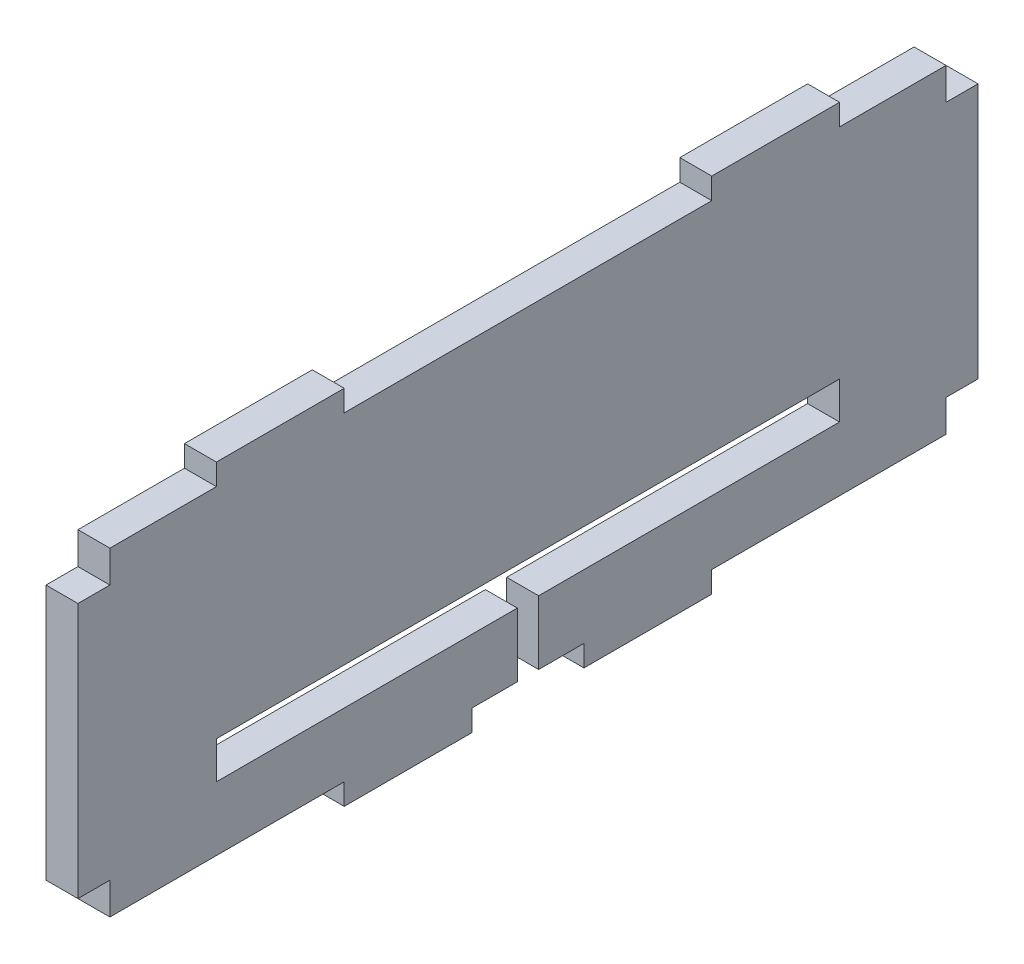
ISO-10303-21;
HEADER;
FILE_DESCRIPTION(('STEP AP214'),'2;1');
FILE_NAME('part.step','',(''),(''),'','','');
FILE_SCHEMA(('AUTOMOTIVE_DESIGN { 1 0 10303 214 1 1 1 1 }'));
ENDSEC;
DATA;
#1=APPLICATION_CONTEXT('core data for automotive mechanical design processes');
#2=APPLICATION_PROTOCOL_DEFINITION('international standard','automotive_design',2000,#1);
#3=PRODUCT_CONTEXT('',#1,'mechanical');
#4=PRODUCT('Part','Part','',(#3));
#5=PRODUCT_RELATED_PRODUCT_CATEGORY('part','',(#4));
#6=PRODUCT_DEFINITION_FORMATION('','',#4);
#7=PRODUCT_DEFINITION_CONTEXT('part definition',#1,'design');
#8=PRODUCT_DEFINITION('design','',#6,#7);
#9=PRODUCT_DEFINITION_SHAPE('','',#8);
#10=(LENGTH_UNIT() NAMED_UNIT(*) SI_UNIT(.MILLI.,.METRE.));
#11=(NAMED_UNIT(*) PLANE_ANGLE_UNIT() SI_UNIT($,.RADIAN.));
#12=(NAMED_UNIT(*) SI_UNIT($,.STERADIAN.) SOLID_ANGLE_UNIT());
#13=UNCERTAINTY_MEASURE_WITH_UNIT(LENGTH_MEASURE(1.E-05),#10,'distance_accuracy_value','');
#14=(GEOMETRIC_REPRESENTATION_CONTEXT(3) GLOBAL_UNCERTAINTY_ASSIGNED_CONTEXT((#13)) GLOBAL_UNIT_ASSIGNED_CONTEXT((#10,
#11,#12)) REPRESENTATION_CONTEXT('',''));
#15=CARTESIAN_POINT('',(0.,0.,0.));
#16=DIRECTION('',(0.,0.,1.));
#17=DIRECTION('',(1.,0.,0.));
#18=AXIS2_PLACEMENT_3D('',#15,#16,#17);
#19=CARTESIAN_POINT('',(3.,29.,0.));
#20=DIRECTION('',(0.,1.,0.));
#21=DIRECTION('',(0.,0.,1.));
#22=AXIS2_PLACEMENT_3D('',#19,#20,#21);
#23=PLANE('',#22);
#24=DIRECTION('',(0.,0.,-1.));
#25=VECTOR('',#24,1.);
#26=CARTESIAN_POINT('',(0.,29.,0.));
#27=LINE('',#26,#25);
#28=CARTESIAN_POINT('',(0.,29.,-81.51));
#29=VERTEX_POINT('',#28);
#30=CARTESIAN_POINT('',(0.,29.,-84.51));
#31=VERTEX_POINT('',#30);
#32=EDGE_CURVE('E295',#29,#31,#27,.T.);
#33=ORIENTED_EDGE('',*,*,#32,.F.);
#34=DIRECTION('',(-1.,0.,0.));
#35=VECTOR('',#34,1.);
#36=CARTESIAN_POINT('',(3.,29.,-81.51));
#37=LINE('',#36,#35);
#38=CARTESIAN_POINT('',(3.,29.,-81.51));
#39=VERTEX_POINT('',#38);
#40=EDGE_CURVE('E11',#39,#29,#37,.T.);
#41=ORIENTED_EDGE('',*,*,#40,.F.);
#42=DIRECTION('',(0.,0.,-1.));
#43=VECTOR('',#42,1.);
#44=CARTESIAN_POINT('',(3.,29.,0.));
#45=LINE('',#44,#43);
#46=CARTESIAN_POINT('',(3.,29.,-84.51));
#47=VERTEX_POINT('',#46);
#48=EDGE_CURVE('E379',#39,#47,#45,.T.);
#49=ORIENTED_EDGE('',*,*,#48,.T.);
#50=DIRECTION('',(-1.,0.,0.));
#51=VECTOR('',#50,1.);
#52=CARTESIAN_POINT('',(3.,29.,-84.51));
#53=LINE('',#52,#51);
#54=EDGE_CURVE('E170',#47,#31,#53,.T.);
#55=ORIENTED_EDGE('',*,*,#54,.T.);
#56=EDGE_LOOP('',(#33,#41,#49,#55));
#57=FACE_BOUND('',#56,.T.);
#58=ADVANCED_FACE('F35',(#57),#23,.T.);
#59=CARTESIAN_POINT('',(3.,0.,-81.51));
#60=DIRECTION('',(0.,0.,-1.));
#61=DIRECTION('',(-1.,0.,0.));
#62=AXIS2_PLACEMENT_3D('',#59,#60,#61);
#63=PLANE('',#62);
#64=DIRECTION('',(0.,-1.,0.));
#65=VECTOR('',#64,1.);
#66=CARTESIAN_POINT('',(0.,0.,-81.51));
#67=LINE('',#66,#65);
#68=CARTESIAN_POINT('',(0.,32.,-81.51));
#69=VERTEX_POINT('',#68);
#70=EDGE_CURVE('E298',#69,#29,#67,.T.);
#71=ORIENTED_EDGE('',*,*,#70,.F.);
#72=DIRECTION('',(-1.,0.,0.));
#73=VECTOR('',#72,1.);
#74=CARTESIAN_POINT('',(3.,32.,-81.51));
#75=LINE('',#74,#73);
#76=CARTESIAN_POINT('',(3.,32.,-81.51));
#77=VERTEX_POINT('',#76);
#78=EDGE_CURVE('E43',#77,#69,#75,.T.);
#79=ORIENTED_EDGE('',*,*,#78,.F.);
#80=DIRECTION('',(0.,-1.,0.));
#81=VECTOR('',#80,1.);
#82=CARTESIAN_POINT('',(3.,0.,-81.51));
#83=LINE('',#82,#81);
#84=EDGE_CURVE('E479',#77,#39,#83,.T.);
#85=ORIENTED_EDGE('',*,*,#84,.T.);
#86=ORIENTED_EDGE('',*,*,#40,.T.);
#87=EDGE_LOOP('',(#71,#79,#85,#86));
#88=FACE_BOUND('',#87,.T.);
#89=ADVANCED_FACE('F467',(#88),#63,.T.);
#90=CARTESIAN_POINT('',(3.,32.,0.));
#91=DIRECTION('',(0.,1.,0.));
#92=DIRECTION('',(0.,0.,1.));
#93=AXIS2_PLACEMENT_3D('',#90,#91,#92);
#94=PLANE('',#93);
#95=DIRECTION('',(0.,0.,-1.));
#96=VECTOR('',#95,1.);
#97=CARTESIAN_POINT('',(0.,32.,0.));
#98=LINE('',#97,#96);
#99=CARTESIAN_POINT('',(0.,32.,-71.51));
#100=VERTEX_POINT('',#99);
#101=EDGE_CURVE('E301',#100,#69,#98,.T.);
#102=ORIENTED_EDGE('',*,*,#101,.F.);
#103=DIRECTION('',(-1.,0.,0.));
#104=VECTOR('',#103,1.);
#105=CARTESIAN_POINT('',(3.,32.,-71.51));
#106=LINE('',#105,#104);
#107=CARTESIAN_POINT('',(3.,32.,-71.51));
#108=VERTEX_POINT('',#107);
#109=EDGE_CURVE('E456',#108,#100,#106,.T.);
#110=ORIENTED_EDGE('',*,*,#109,.F.);
#111=DIRECTION('',(0.,0.,-1.));
#112=VECTOR('',#111,1.);
#113=CARTESIAN_POINT('',(3.,32.,0.));
#114=LINE('',#113,#112);
#115=EDGE_CURVE('E463',#108,#77,#114,.T.);
#116=ORIENTED_EDGE('',*,*,#115,.T.);
#117=ORIENTED_EDGE('',*,*,#78,.T.);
#118=EDGE_LOOP('',(#102,#110,#116,#117));
#119=FACE_BOUND('',#118,.T.);
#120=ADVANCED_FACE('F461',(#119),#94,.T.);
#121=CARTESIAN_POINT('',(3.,0.,-71.51));
#122=DIRECTION('',(0.,0.,-1.));
#123=DIRECTION('',(-1.,0.,0.));
#124=AXIS2_PLACEMENT_3D('',#121,#122,#123);
#125=PLANE('',#124);
#126=DIRECTION('',(0.,-1.,0.));
#127=VECTOR('',#126,1.);
#128=CARTESIAN_POINT('',(0.,0.,-71.51));
#129=LINE('',#128,#127);
#130=CARTESIAN_POINT('',(0.,34.,-71.51));
#131=VERTEX_POINT('',#130);
#132=EDGE_CURVE('E304',#131,#100,#129,.T.);
#133=ORIENTED_EDGE('',*,*,#132,.F.);
#134=DIRECTION('',(-1.,0.,0.));
#135=VECTOR('',#134,1.);
#136=CARTESIAN_POINT('',(3.,34.,-71.51));
#137=LINE('',#136,#135);
#138=CARTESIAN_POINT('',(3.,34.,-71.51));
#139=VERTEX_POINT('',#138);
#140=EDGE_CURVE('E454',#139,#131,#137,.T.);
#141=ORIENTED_EDGE('',*,*,#140,.F.);
#142=DIRECTION('',(0.,-1.,0.));
#143=VECTOR('',#142,1.);
#144=CARTESIAN_POINT('',(3.,0.,-71.51));
#145=LINE('',#144,#143);
#146=EDGE_CURVE('E476',#139,#108,#145,.T.);
#147=ORIENTED_EDGE('',*,*,#146,.T.);
#148=ORIENTED_EDGE('',*,*,#109,.T.);
#149=EDGE_LOOP('',(#133,#141,#147,#148));
#150=FACE_BOUND('',#149,.T.);
#151=ADVANCED_FACE('F473',(#150),#125,.T.);
#152=CARTESIAN_POINT('',(3.,34.,0.));
#153=DIRECTION('',(0.,1.,0.));
#154=DIRECTION('',(0.,0.,1.));
#155=AXIS2_PLACEMENT_3D('',#152,#153,#154);
#156=PLANE('',#155);
#157=DIRECTION('',(0.,0.,-1.));
#158=VECTOR('',#157,1.);
#159=CARTESIAN_POINT('',(0.,34.,0.));
#160=LINE('',#159,#158);
#161=CARTESIAN_POINT('',(0.,34.,-59.51));
#162=VERTEX_POINT('',#161);
#163=EDGE_CURVE('E307',#162,#131,#160,.T.);
#164=ORIENTED_EDGE('',*,*,#163,.F.);
#165=DIRECTION('',(-1.,0.,0.));
#166=VECTOR('',#165,1.);
#167=CARTESIAN_POINT('',(3.,34.,-59.51));
#168=LINE('',#167,#166);
#169=CARTESIAN_POINT('',(3.,34.,-59.51));
#170=VERTEX_POINT('',#169);
#171=EDGE_CURVE('E452',#170,#162,#168,.T.);
#172=ORIENTED_EDGE('',*,*,#171,.F.);
#173=DIRECTION('',(0.,0.,-1.));
#174=VECTOR('',#173,1.);
#175=CARTESIAN_POINT('',(3.,34.,0.));
#176=LINE('',#175,#174);
#177=EDGE_CURVE('E481',#170,#139,#176,.T.);
#178=ORIENTED_EDGE('',*,*,#177,.T.);
#179=ORIENTED_EDGE('',*,*,#140,.T.);
#180=EDGE_LOOP('',(#164,#172,#178,#179));
#181=FACE_BOUND('',#180,.T.);
#182=ADVANCED_FACE('F577',(#181),#156,.T.);
#183=CARTESIAN_POINT('',(3.,0.,-59.51));
#184=DIRECTION('',(0.,0.,1.));
#185=DIRECTION('',(1.,0.,0.));
#186=AXIS2_PLACEMENT_3D('',#183,#184,#185);
#187=PLANE('',#186);
#188=DIRECTION('',(0.,1.,0.));
#189=VECTOR('',#188,1.);
#190=CARTESIAN_POINT('',(0.,0.,-59.51));
#191=LINE('',#190,#189);
#192=CARTESIAN_POINT('',(0.,32.,-59.51));
#193=VERTEX_POINT('',#192);
#194=EDGE_CURVE('E310',#193,#162,#191,.T.);
#195=ORIENTED_EDGE('',*,*,#194,.F.);
#196=DIRECTION('',(-1.,0.,0.));
#197=VECTOR('',#196,1.);
#198=CARTESIAN_POINT('',(3.,32.,-59.51));
#199=LINE('',#198,#197);
#200=CARTESIAN_POINT('',(3.,32.,-59.51));
#201=VERTEX_POINT('',#200);
#202=EDGE_CURVE('E450',#201,#193,#199,.T.);
#203=ORIENTED_EDGE('',*,*,#202,.F.);
#204=DIRECTION('',(0.,1.,0.));
#205=VECTOR('',#204,1.);
#206=CARTESIAN_POINT('',(3.,0.,-59.51));
#207=LINE('',#206,#205);
#208=EDGE_CURVE('E487',#201,#170,#207,.T.);
#209=ORIENTED_EDGE('',*,*,#208,.T.);
#210=ORIENTED_EDGE('',*,*,#171,.T.);
#211=EDGE_LOOP('',(#195,#203,#209,#210));
#212=FACE_BOUND('',#211,.T.);
#213=ADVANCED_FACE('F578',(#212),#187,.T.);
#214=CARTESIAN_POINT('',(3.,32.,0.));
#215=DIRECTION('',(0.,1.,0.));
#216=DIRECTION('',(0.,0.,1.));
#217=AXIS2_PLACEMENT_3D('',#214,#215,#216);
#218=PLANE('',#217);
#219=DIRECTION('',(0.,0.,-1.));
#220=VECTOR('',#219,1.);
#221=CARTESIAN_POINT('',(0.,32.,0.));
#222=LINE('',#221,#220);
#223=CARTESIAN_POINT('',(0.,32.,-25.));
#224=VERTEX_POINT('',#223);
#225=EDGE_CURVE('E314',#224,#193,#222,.T.);
#226=ORIENTED_EDGE('',*,*,#225,.F.);
#227=DIRECTION('',(-1.,0.,0.));
#228=VECTOR('',#227,1.);
#229=CARTESIAN_POINT('',(3.,32.,-25.));
#230=LINE('',#229,#228);
#231=CARTESIAN_POINT('',(3.,32.,-25.));
#232=VERTEX_POINT('',#231);
#233=EDGE_CURVE('E448',#232,#224,#230,.T.);
#234=ORIENTED_EDGE('',*,*,#233,.F.);
#235=DIRECTION('',(0.,0.,-1.));
#236=VECTOR('',#235,1.);
#237=CARTESIAN_POINT('',(3.,32.,0.));
#238=LINE('',#237,#236);
#239=EDGE_CURVE('E491',#232,#201,#238,.T.);
#240=ORIENTED_EDGE('',*,*,#239,.T.);
#241=ORIENTED_EDGE('',*,*,#202,.T.);
#242=EDGE_LOOP('',(#226,#234,#240,#241));
#243=FACE_BOUND('',#242,.T.);
#244=ADVANCED_FACE('F581',(#243),#218,.T.);
#245=CARTESIAN_POINT('',(3.,0.,-25.));
#246=DIRECTION('',(0.,0.,-1.));
#247=DIRECTION('',(-1.,0.,0.));
#248=AXIS2_PLACEMENT_3D('',#245,#246,#247);
#249=PLANE('',#248);
#250=DIRECTION('',(0.,-1.,0.));
#251=VECTOR('',#250,1.);
#252=CARTESIAN_POINT('',(0.,0.,-25.));
#253=LINE('',#252,#251);
#254=CARTESIAN_POINT('',(0.,34.,-25.));
#255=VERTEX_POINT('',#254);
#256=EDGE_CURVE('E317',#255,#224,#253,.T.);
#257=ORIENTED_EDGE('',*,*,#256,.F.);
#258=DIRECTION('',(-1.,0.,0.));
#259=VECTOR('',#258,1.);
#260=CARTESIAN_POINT('',(3.,34.,-25.));
#261=LINE('',#260,#259);
#262=CARTESIAN_POINT('',(3.,34.,-25.));
#263=VERTEX_POINT('',#262);
#264=EDGE_CURVE('E446',#263,#255,#261,.T.);
#265=ORIENTED_EDGE('',*,*,#264,.F.);
#266=DIRECTION('',(0.,-1.,0.));
#267=VECTOR('',#266,1.);
#268=CARTESIAN_POINT('',(3.,0.,-25.));
#269=LINE('',#268,#267);
#270=EDGE_CURVE('E494',#263,#232,#269,.T.);
#271=ORIENTED_EDGE('',*,*,#270,.T.);
#272=ORIENTED_EDGE('',*,*,#233,.T.);
#273=EDGE_LOOP('',(#257,#265,#271,#272));
#274=FACE_BOUND('',#273,.T.);
#275=ADVANCED_FACE('F585',(#274),#249,.T.);
#276=CARTESIAN_POINT('',(0.,34.,-13.));
#277=VERTEX_POINT('',#276);
#278=EDGE_CURVE('E311',#277,#255,#160,.T.);
#279=ORIENTED_EDGE('',*,*,#278,.F.);
#280=DIRECTION('',(-1.,0.,0.));
#281=VECTOR('',#280,1.);
#282=CARTESIAN_POINT('',(3.,34.,-13.));
#283=LINE('',#282,#281);
#284=CARTESIAN_POINT('',(3.,34.,-13.));
#285=VERTEX_POINT('',#284);
#286=EDGE_CURVE('E444',#285,#277,#283,.T.);
#287=ORIENTED_EDGE('',*,*,#286,.F.);
#288=EDGE_CURVE('E488',#285,#263,#176,.T.);
#289=ORIENTED_EDGE('',*,*,#288,.T.);
#290=ORIENTED_EDGE('',*,*,#264,.T.);
#291=EDGE_LOOP('',(#279,#287,#289,#290));
#292=FACE_BOUND('',#291,.T.);
#293=ADVANCED_FACE('F589',(#292),#156,.T.);
#294=CARTESIAN_POINT('',(3.,0.,-13.));
#295=DIRECTION('',(0.,0.,1.));
#296=DIRECTION('',(1.,0.,0.));
#297=AXIS2_PLACEMENT_3D('',#294,#295,#296);
#298=PLANE('',#297);
#299=DIRECTION('',(0.,1.,0.));
#300=VECTOR('',#299,1.);
#301=CARTESIAN_POINT('',(0.,0.,-13.));
#302=LINE('',#301,#300);
#303=CARTESIAN_POINT('',(0.,32.,-13.));
#304=VERTEX_POINT('',#303);
#305=EDGE_CURVE('E320',#304,#277,#302,.T.);
#306=ORIENTED_EDGE('',*,*,#305,.F.);
#307=DIRECTION('',(-1.,0.,0.));
#308=VECTOR('',#307,1.);
#309=CARTESIAN_POINT('',(3.,32.,-13.));
#310=LINE('',#309,#308);
#311=CARTESIAN_POINT('',(3.,32.,-13.));
#312=VERTEX_POINT('',#311);
#313=EDGE_CURVE('E442',#312,#304,#310,.T.);
#314=ORIENTED_EDGE('',*,*,#313,.F.);
#315=DIRECTION('',(0.,1.,0.));
#316=VECTOR('',#315,1.);
#317=CARTESIAN_POINT('',(3.,0.,-13.));
#318=LINE('',#317,#316);
#319=EDGE_CURVE('E497',#312,#285,#318,.T.);
#320=ORIENTED_EDGE('',*,*,#319,.T.);
#321=ORIENTED_EDGE('',*,*,#286,.T.);
#322=EDGE_LOOP('',(#306,#314,#320,#321));
#323=FACE_BOUND('',#322,.T.);
#324=ADVANCED_FACE('F593',(#323),#298,.T.);
#325=CARTESIAN_POINT('',(3.,32.,0.));
#326=DIRECTION('',(0.,1.,0.));
#327=DIRECTION('',(0.,0.,1.));
#328=AXIS2_PLACEMENT_3D('',#325,#326,#327);
#329=PLANE('',#328);
#330=DIRECTION('',(0.,0.,-1.));
#331=VECTOR('',#330,1.);
#332=CARTESIAN_POINT('',(0.,32.,0.));
#333=LINE('',#332,#331);
#334=CARTESIAN_POINT('',(0.,32.,-2.99999999999999));
#335=VERTEX_POINT('',#334);
#336=EDGE_CURVE('E323',#335,#304,#333,.T.);
#337=ORIENTED_EDGE('',*,*,#336,.F.);
#338=DIRECTION('',(-1.,0.,0.));
#339=VECTOR('',#338,1.);
#340=CARTESIAN_POINT('',(3.,32.,-2.99999999999999));
#341=LINE('',#340,#339);
#342=CARTESIAN_POINT('',(3.,32.,-2.99999999999999));
#343=VERTEX_POINT('',#342);
#344=EDGE_CURVE('E440',#343,#335,#341,.T.);
#345=ORIENTED_EDGE('',*,*,#344,.F.);
#346=DIRECTION('',(0.,0.,-1.));
#347=VECTOR('',#346,1.);
#348=CARTESIAN_POINT('',(3.,32.,0.));
#349=LINE('',#348,#347);
#350=EDGE_CURVE('E500',#343,#312,#349,.T.);
#351=ORIENTED_EDGE('',*,*,#350,.T.);
#352=ORIENTED_EDGE('',*,*,#313,.T.);
#353=EDGE_LOOP('',(#337,#345,#351,#352));
#354=FACE_BOUND('',#353,.T.);
#355=ADVANCED_FACE('F597',(#354),#329,.T.);
#356=CARTESIAN_POINT('',(3.,0.,-2.99999999999999));
#357=DIRECTION('',(0.,0.,1.));
#358=DIRECTION('',(1.,0.,0.));
#359=AXIS2_PLACEMENT_3D('',#356,#357,#358);
#360=PLANE('',#359);
#361=DIRECTION('',(0.,1.,0.));
#362=VECTOR('',#361,1.);
#363=CARTESIAN_POINT('',(0.,0.,-2.99999999999999));
#364=LINE('',#363,#362);
#365=CARTESIAN_POINT('',(0.,29.,-2.99999999999999));
#366=VERTEX_POINT('',#365);
#367=EDGE_CURVE('E326',#366,#335,#364,.T.);
#368=ORIENTED_EDGE('',*,*,#367,.F.);
#369=DIRECTION('',(-1.,0.,0.));
#370=VECTOR('',#369,1.);
#371=CARTESIAN_POINT('',(3.,29.,-2.99999999999999));
#372=LINE('',#371,#370);
#373=CARTESIAN_POINT('',(3.,29.,-2.99999999999999));
#374=VERTEX_POINT('',#373);
#375=EDGE_CURVE('E438',#374,#366,#372,.T.);
#376=ORIENTED_EDGE('',*,*,#375,.F.);
#377=DIRECTION('',(0.,1.,0.));
#378=VECTOR('',#377,1.);
#379=CARTESIAN_POINT('',(3.,0.,-2.99999999999999));
#380=LINE('',#379,#378);
#381=EDGE_CURVE('E503',#374,#343,#380,.T.);
#382=ORIENTED_EDGE('',*,*,#381,.T.);
#383=ORIENTED_EDGE('',*,*,#344,.T.);
#384=EDGE_LOOP('',(#368,#376,#382,#383));
#385=FACE_BOUND('',#384,.T.);
#386=ADVANCED_FACE('F601',(#385),#360,.T.);
#387=CARTESIAN_POINT('',(3.,29.,0.));
#388=DIRECTION('',(0.,1.,0.));
#389=DIRECTION('',(0.,0.,1.));
#390=AXIS2_PLACEMENT_3D('',#387,#388,#389);
#391=PLANE('',#390);
#392=DIRECTION('',(0.,0.,-1.));
#393=VECTOR('',#392,1.);
#394=CARTESIAN_POINT('',(0.,29.,0.));
#395=LINE('',#394,#393);
#396=CARTESIAN_POINT('',(0.,29.,0.));
#397=VERTEX_POINT('',#396);
#398=EDGE_CURVE('E329',#397,#366,#395,.T.);
#399=ORIENTED_EDGE('',*,*,#398,.F.);
#400=DIRECTION('',(-1.,0.,0.));
#401=VECTOR('',#400,1.);
#402=CARTESIAN_POINT('',(3.,29.,0.));
#403=LINE('',#402,#401);
#404=CARTESIAN_POINT('',(3.,29.,0.));
#405=VERTEX_POINT('',#404);
#406=EDGE_CURVE('E436',#405,#397,#403,.T.);
#407=ORIENTED_EDGE('',*,*,#406,.F.);
#408=DIRECTION('',(0.,0.,-1.));
#409=VECTOR('',#408,1.);
#410=CARTESIAN_POINT('',(3.,29.,0.));
#411=LINE('',#410,#409);
#412=EDGE_CURVE('E506',#405,#374,#411,.T.);
#413=ORIENTED_EDGE('',*,*,#412,.T.);
#414=ORIENTED_EDGE('',*,*,#375,.T.);
#415=EDGE_LOOP('',(#399,#407,#413,#414));
#416=FACE_BOUND('',#415,.T.);
#417=ADVANCED_FACE('F605',(#416),#391,.T.);
#418=CARTESIAN_POINT('',(3.,0.,0.));
#419=DIRECTION('',(0.,0.,-1.));
#420=DIRECTION('',(-1.,0.,0.));
#421=AXIS2_PLACEMENT_3D('',#418,#419,#420);
#422=PLANE('',#421);
#423=DIRECTION('',(0.,-1.,0.));
#424=VECTOR('',#423,1.);
#425=CARTESIAN_POINT('',(0.,0.,0.));
#426=LINE('',#425,#424);
#427=CARTESIAN_POINT('',(0.,5.,0.));
#428=VERTEX_POINT('',#427);
#429=EDGE_CURVE('E332',#397,#428,#426,.T.);
#430=ORIENTED_EDGE('',*,*,#429,.T.);
#431=DIRECTION('',(-1.,0.,0.));
#432=VECTOR('',#431,1.);
#433=CARTESIAN_POINT('',(3.,5.,0.));
#434=LINE('',#433,#432);
#435=CARTESIAN_POINT('',(3.,5.,0.));
#436=VERTEX_POINT('',#435);
#437=EDGE_CURVE('E433',#436,#428,#434,.T.);
#438=ORIENTED_EDGE('',*,*,#437,.F.);
#439=DIRECTION('',(0.,-1.,0.));
#440=VECTOR('',#439,1.);
#441=CARTESIAN_POINT('',(3.,0.,0.));
#442=LINE('',#441,#440);
#443=EDGE_CURVE('E509',#405,#436,#442,.T.);
#444=ORIENTED_EDGE('',*,*,#443,.F.);
#445=ORIENTED_EDGE('',*,*,#406,.T.);
#446=EDGE_LOOP('',(#430,#438,#444,#445));
#447=FACE_BOUND('',#446,.T.);
#448=ADVANCED_FACE('F609',(#447),#422,.F.);
#449=CARTESIAN_POINT('',(3.,5.,0.));
#450=DIRECTION('',(0.,1.,0.));
#451=DIRECTION('',(0.,0.,1.));
#452=AXIS2_PLACEMENT_3D('',#449,#450,#451);
#453=PLANE('',#452);
#454=DIRECTION('',(0.,0.,-1.));
#455=VECTOR('',#454,1.);
#456=CARTESIAN_POINT('',(0.,5.,0.));
#457=LINE('',#456,#455);
#458=CARTESIAN_POINT('',(0.,5.,-3.));
#459=VERTEX_POINT('',#458);
#460=EDGE_CURVE('E334',#428,#459,#457,.T.);
#461=ORIENTED_EDGE('',*,*,#460,.T.);
#462=DIRECTION('',(-1.,0.,0.));
#463=VECTOR('',#462,1.);
#464=CARTESIAN_POINT('',(3.,5.,-3.));
#465=LINE('',#464,#463);
#466=CARTESIAN_POINT('',(3.,5.,-3.));
#467=VERTEX_POINT('',#466);
#468=EDGE_CURVE('E430',#467,#459,#465,.T.);
#469=ORIENTED_EDGE('',*,*,#468,.F.);
#470=DIRECTION('',(0.,0.,-1.));
#471=VECTOR('',#470,1.);
#472=CARTESIAN_POINT('',(3.,5.,0.));
#473=LINE('',#472,#471);
#474=EDGE_CURVE('E511',#436,#467,#473,.T.);
#475=ORIENTED_EDGE('',*,*,#474,.F.);
#476=ORIENTED_EDGE('',*,*,#437,.T.);
#477=EDGE_LOOP('',(#461,#469,#475,#476));
#478=FACE_BOUND('',#477,.T.);
#479=ADVANCED_FACE('F613',(#478),#453,.F.);
#480=CARTESIAN_POINT('',(3.,0.,-3.));
#481=DIRECTION('',(0.,0.,-1.));
#482=DIRECTION('',(0.,1.,0.));
#483=AXIS2_PLACEMENT_3D('',#480,#481,#482);
#484=PLANE('',#483);
#485=DIRECTION('',(0.,-1.,0.));
#486=VECTOR('',#485,1.);
#487=CARTESIAN_POINT('',(0.,0.,-3.));
#488=LINE('',#487,#486);
#489=CARTESIAN_POINT('',(0.,2.,-3.));
#490=VERTEX_POINT('',#489);
#491=EDGE_CURVE('E336',#459,#490,#488,.T.);
#492=ORIENTED_EDGE('',*,*,#491,.T.);
#493=DIRECTION('',(-1.,0.,0.));
#494=VECTOR('',#493,1.);
#495=CARTESIAN_POINT('',(3.,2.,-3.));
#496=LINE('',#495,#494);
#497=CARTESIAN_POINT('',(3.,2.,-3.));
#498=VERTEX_POINT('',#497);
#499=EDGE_CURVE('E427',#498,#490,#496,.T.);
#500=ORIENTED_EDGE('',*,*,#499,.F.);
#501=DIRECTION('',(0.,-1.,0.));
#502=VECTOR('',#501,1.);
#503=CARTESIAN_POINT('',(3.,0.,-3.));
#504=LINE('',#503,#502);
#505=EDGE_CURVE('E513',#467,#498,#504,.T.);
#506=ORIENTED_EDGE('',*,*,#505,.F.);
#507=ORIENTED_EDGE('',*,*,#468,.T.);
#508=EDGE_LOOP('',(#492,#500,#506,#507));
#509=FACE_BOUND('',#508,.T.);
#510=ADVANCED_FACE('F617',(#509),#484,.F.);
#511=CARTESIAN_POINT('',(3.,2.,0.));
#512=DIRECTION('',(0.,1.,0.));
#513=DIRECTION('',(0.,0.,1.));
#514=AXIS2_PLACEMENT_3D('',#511,#512,#513);
#515=PLANE('',#514);
#516=DIRECTION('',(0.,0.,-1.));
#517=VECTOR('',#516,1.);
#518=CARTESIAN_POINT('',(0.,2.,0.));
#519=LINE('',#518,#517);
#520=CARTESIAN_POINT('',(0.,2.,-25.));
#521=VERTEX_POINT('',#520);
#522=EDGE_CURVE('E338',#490,#521,#519,.T.);
#523=ORIENTED_EDGE('',*,*,#522,.T.);
#524=DIRECTION('',(-1.,0.,0.));
#525=VECTOR('',#524,1.);
#526=CARTESIAN_POINT('',(3.,2.,-25.));
#527=LINE('',#526,#525);
#528=CARTESIAN_POINT('',(3.,2.,-25.));
#529=VERTEX_POINT('',#528);
#530=EDGE_CURVE('E424',#529,#521,#527,.T.);
#531=ORIENTED_EDGE('',*,*,#530,.F.);
#532=DIRECTION('',(0.,0.,-1.));
#533=VECTOR('',#532,1.);
#534=CARTESIAN_POINT('',(3.,2.,0.));
#535=LINE('',#534,#533);
#536=EDGE_CURVE('E515',#498,#529,#535,.T.);
#537=ORIENTED_EDGE('',*,*,#536,.F.);
#538=ORIENTED_EDGE('',*,*,#499,.T.);
#539=EDGE_LOOP('',(#523,#531,#537,#538));
#540=FACE_BOUND('',#539,.T.);
#541=ADVANCED_FACE('F621',(#540),#515,.F.);
#542=CARTESIAN_POINT('',(3.,0.,-25.));
#543=DIRECTION('',(0.,0.,-1.));
#544=DIRECTION('',(-1.,0.,0.));
#545=AXIS2_PLACEMENT_3D('',#542,#543,#544);
#546=PLANE('',#545);
#547=DIRECTION('',(0.,-1.,0.));
#548=VECTOR('',#547,1.);
#549=CARTESIAN_POINT('',(0.,0.,-25.));
#550=LINE('',#549,#548);
#551=CARTESIAN_POINT('',(0.,0.,-25.));
#552=VERTEX_POINT('',#551);
#553=EDGE_CURVE('E340',#521,#552,#550,.T.);
#554=ORIENTED_EDGE('',*,*,#553,.T.);
#555=DIRECTION('',(-1.,0.,0.));
#556=VECTOR('',#555,1.);
#557=CARTESIAN_POINT('',(3.,0.,-25.));
#558=LINE('',#557,#556);
#559=CARTESIAN_POINT('',(3.,0.,-25.));
#560=VERTEX_POINT('',#559);
#561=EDGE_CURVE('E421',#560,#552,#558,.T.);
#562=ORIENTED_EDGE('',*,*,#561,.F.);
#563=DIRECTION('',(0.,-1.,0.));
#564=VECTOR('',#563,1.);
#565=CARTESIAN_POINT('',(3.,0.,-25.));
#566=LINE('',#565,#564);
#567=EDGE_CURVE('E517',#529,#560,#566,.T.);
#568=ORIENTED_EDGE('',*,*,#567,.F.);
#569=ORIENTED_EDGE('',*,*,#530,.T.);
#570=EDGE_LOOP('',(#554,#562,#568,#569));
#571=FACE_BOUND('',#570,.T.);
#572=ADVANCED_FACE('F625',(#571),#546,.F.);
#573=CARTESIAN_POINT('',(3.,0.,0.));
#574=DIRECTION('',(0.,1.,0.));
#575=DIRECTION('',(0.,0.,1.));
#576=AXIS2_PLACEMENT_3D('',#573,#574,#575);
#577=PLANE('',#576);
#578=DIRECTION('',(0.,0.,-1.));
#579=VECTOR('',#578,1.);
#580=CARTESIAN_POINT('',(0.,0.,0.));
#581=LINE('',#580,#579);
#582=CARTESIAN_POINT('',(0.,0.,-37.));
#583=VERTEX_POINT('',#582);
#584=EDGE_CURVE('E342',#552,#583,#581,.T.);
#585=ORIENTED_EDGE('',*,*,#584,.T.);
#586=DIRECTION('',(-1.,0.,0.));
#587=VECTOR('',#586,1.);
#588=CARTESIAN_POINT('',(3.,0.,-37.));
#589=LINE('',#588,#587);
#590=CARTESIAN_POINT('',(3.,0.,-37.));
#591=VERTEX_POINT('',#590);
#592=EDGE_CURVE('E418',#591,#583,#589,.T.);
#593=ORIENTED_EDGE('',*,*,#592,.F.);
#594=DIRECTION('',(0.,0.,-1.));
#595=VECTOR('',#594,1.);
#596=CARTESIAN_POINT('',(3.,0.,0.));
#597=LINE('',#596,#595);
#598=EDGE_CURVE('E519',#560,#591,#597,.T.);
#599=ORIENTED_EDGE('',*,*,#598,.F.);
#600=ORIENTED_EDGE('',*,*,#561,.T.);
#601=EDGE_LOOP('',(#585,#593,#599,#600));
#602=FACE_BOUND('',#601,.T.);
#603=ADVANCED_FACE('F629',(#602),#577,.F.);
#604=CARTESIAN_POINT('',(3.,0.,-37.));
#605=DIRECTION('',(0.,0.,1.));
#606=DIRECTION('',(1.,0.,0.));
#607=AXIS2_PLACEMENT_3D('',#604,#605,#606);
#608=PLANE('',#607);
#609=DIRECTION('',(0.,1.,0.));
#610=VECTOR('',#609,1.);
#611=CARTESIAN_POINT('',(0.,0.,-37.));
#612=LINE('',#611,#610);
#613=CARTESIAN_POINT('',(0.,2.,-37.));
#614=VERTEX_POINT('',#613);
#615=EDGE_CURVE('E344',#583,#614,#612,.T.);
#616=ORIENTED_EDGE('',*,*,#615,.T.);
#617=DIRECTION('',(-1.,0.,0.));
#618=VECTOR('',#617,1.);
#619=CARTESIAN_POINT('',(3.,2.,-37.));
#620=LINE('',#619,#618);
#621=CARTESIAN_POINT('',(3.,2.,-37.));
#622=VERTEX_POINT('',#621);
#623=EDGE_CURVE('E416',#622,#614,#620,.T.);
#624=ORIENTED_EDGE('',*,*,#623,.F.);
#625=DIRECTION('',(0.,1.,0.));
#626=VECTOR('',#625,1.);
#627=CARTESIAN_POINT('',(3.,0.,-37.));
#628=LINE('',#627,#626);
#629=EDGE_CURVE('E521',#591,#622,#628,.T.);
#630=ORIENTED_EDGE('',*,*,#629,.F.);
#631=ORIENTED_EDGE('',*,*,#592,.T.);
#632=EDGE_LOOP('',(#616,#624,#630,#631));
#633=FACE_BOUND('',#632,.T.);
#634=ADVANCED_FACE('F631',(#633),#608,.F.);
#635=CARTESIAN_POINT('',(3.,2.,0.));
#636=DIRECTION('',(0.,-1.,0.));
#637=DIRECTION('',(0.,0.,-1.));
#638=AXIS2_PLACEMENT_3D('',#635,#636,#637);
#639=PLANE('',#638);
#640=DIRECTION('',(0.,0.,1.));
#641=VECTOR('',#640,1.);
#642=CARTESIAN_POINT('',(0.,2.,0.));
#643=LINE('',#642,#641);
#644=CARTESIAN_POINT('',(0.,2.,-41.255));
#645=VERTEX_POINT('',#644);
#646=EDGE_CURVE('E348',#645,#614,#643,.T.);
#647=ORIENTED_EDGE('',*,*,#646,.F.);
#648=DIRECTION('',(-1.,0.,0.));
#649=VECTOR('',#648,1.);
#650=CARTESIAN_POINT('',(3.,2.,-41.255));
#651=LINE('',#650,#649);
#652=CARTESIAN_POINT('',(3.,2.,-41.255));
#653=VERTEX_POINT('',#652);
#654=EDGE_CURVE('E414',#653,#645,#651,.T.);
#655=ORIENTED_EDGE('',*,*,#654,.F.);
#656=DIRECTION('',(0.,0.,1.));
#657=VECTOR('',#656,1.);
#658=CARTESIAN_POINT('',(3.,2.,0.));
#659=LINE('',#658,#657);
#660=EDGE_CURVE('E524',#653,#622,#659,.T.);
#661=ORIENTED_EDGE('',*,*,#660,.T.);
#662=ORIENTED_EDGE('',*,*,#623,.T.);
#663=EDGE_LOOP('',(#647,#655,#661,#662));
#664=FACE_BOUND('',#663,.T.);
#665=ADVANCED_FACE('F634',(#664),#639,.T.);
#666=CARTESIAN_POINT('',(3.,0.,-41.255));
#667=DIRECTION('',(0.,0.,-1.));
#668=DIRECTION('',(0.,1.,0.));
#669=AXIS2_PLACEMENT_3D('',#666,#667,#668);
#670=PLANE('',#669);
#671=DIRECTION('',(0.,-1.,0.));
#672=VECTOR('',#671,1.);
#673=CARTESIAN_POINT('',(0.,0.,-41.255));
#674=LINE('',#673,#672);
#675=CARTESIAN_POINT('',(0.,8.,-41.255));
#676=VERTEX_POINT('',#675);
#677=EDGE_CURVE('E351',#676,#645,#674,.T.);
#678=ORIENTED_EDGE('',*,*,#677,.F.);
#679=DIRECTION('',(-1.,0.,0.));
#680=VECTOR('',#679,1.);
#681=CARTESIAN_POINT('',(3.,8.,-41.255));
#682=LINE('',#681,#680);
#683=CARTESIAN_POINT('',(3.,8.,-41.255));
#684=VERTEX_POINT('',#683);
#685=EDGE_CURVE('E412',#684,#676,#682,.T.);
#686=ORIENTED_EDGE('',*,*,#685,.F.);
#687=DIRECTION('',(0.,-1.,0.));
#688=VECTOR('',#687,1.);
#689=CARTESIAN_POINT('',(3.,0.,-41.255));
#690=LINE('',#689,#688);
#691=EDGE_CURVE('E527',#684,#653,#690,.T.);
#692=ORIENTED_EDGE('',*,*,#691,.T.);
#693=ORIENTED_EDGE('',*,*,#654,.T.);
#694=EDGE_LOOP('',(#678,#686,#692,#693));
#695=FACE_BOUND('',#694,.T.);
#696=ADVANCED_FACE('F638',(#695),#670,.T.);
#697=CARTESIAN_POINT('',(3.,8.,0.));
#698=DIRECTION('',(0.,1.,0.));
#699=DIRECTION('',(0.,0.,1.));
#700=AXIS2_PLACEMENT_3D('',#697,#698,#699);
#701=PLANE('',#700);
#702=DIRECTION('',(0.,0.,-1.));
#703=VECTOR('',#702,1.);
#704=CARTESIAN_POINT('',(0.,8.,0.));
#705=LINE('',#704,#703);
#706=CARTESIAN_POINT('',(0.,8.,-13.));
#707=VERTEX_POINT('',#706);
#708=EDGE_CURVE('E354',#707,#676,#705,.T.);
#709=ORIENTED_EDGE('',*,*,#708,.F.);
#710=DIRECTION('',(-1.,0.,0.));
#711=VECTOR('',#710,1.);
#712=CARTESIAN_POINT('',(3.,8.,-13.));
#713=LINE('',#712,#711);
#714=CARTESIAN_POINT('',(3.,8.,-13.));
#715=VERTEX_POINT('',#714);
#716=EDGE_CURVE('E410',#715,#707,#713,.T.);
#717=ORIENTED_EDGE('',*,*,#716,.F.);
#718=DIRECTION('',(0.,0.,-1.));
#719=VECTOR('',#718,1.);
#720=CARTESIAN_POINT('',(3.,8.,0.));
#721=LINE('',#720,#719);
#722=EDGE_CURVE('E530',#715,#684,#721,.T.);
#723=ORIENTED_EDGE('',*,*,#722,.T.);
#724=ORIENTED_EDGE('',*,*,#685,.T.);
#725=EDGE_LOOP('',(#709,#717,#723,#724));
#726=FACE_BOUND('',#725,.T.);
#727=ADVANCED_FACE('F642',(#726),#701,.T.);
#728=CARTESIAN_POINT('',(3.,0.,-13.));
#729=DIRECTION('',(0.,0.,1.));
#730=DIRECTION('',(1.,0.,0.));
#731=AXIS2_PLACEMENT_3D('',#728,#729,#730);
#732=PLANE('',#731);
#733=DIRECTION('',(0.,1.,0.));
#734=VECTOR('',#733,1.);
#735=CARTESIAN_POINT('',(0.,0.,-13.));
#736=LINE('',#735,#734);
#737=CARTESIAN_POINT('',(0.,11.5,-13.));
#738=VERTEX_POINT('',#737);
#739=EDGE_CURVE('E357',#707,#738,#736,.T.);
#740=ORIENTED_EDGE('',*,*,#739,.T.);
#741=DIRECTION('',(-1.,0.,0.));
#742=VECTOR('',#741,1.);
#743=CARTESIAN_POINT('',(3.,11.5,-13.));
#744=LINE('',#743,#742);
#745=CARTESIAN_POINT('',(3.,11.5,-13.));
#746=VERTEX_POINT('',#745);
#747=EDGE_CURVE('E407',#746,#738,#744,.T.);
#748=ORIENTED_EDGE('',*,*,#747,.F.);
#749=DIRECTION('',(0.,1.,0.));
#750=VECTOR('',#749,1.);
#751=CARTESIAN_POINT('',(3.,0.,-13.));
#752=LINE('',#751,#750);
#753=EDGE_CURVE('E533',#715,#746,#752,.T.);
#754=ORIENTED_EDGE('',*,*,#753,.F.);
#755=ORIENTED_EDGE('',*,*,#716,.T.);
#756=EDGE_LOOP('',(#740,#748,#754,#755));
#757=FACE_BOUND('',#756,.T.);
#758=ADVANCED_FACE('F646',(#757),#732,.F.);
#759=CARTESIAN_POINT('',(3.,11.5,0.));
#760=DIRECTION('',(0.,1.,0.));
#761=DIRECTION('',(0.,0.,1.));
#762=AXIS2_PLACEMENT_3D('',#759,#760,#761);
#763=PLANE('',#762);
#764=DIRECTION('',(0.,0.,-1.));
#765=VECTOR('',#764,1.);
#766=CARTESIAN_POINT('',(0.,11.5,0.));
#767=LINE('',#766,#765);
#768=CARTESIAN_POINT('',(0.,11.5,-71.51));
#769=VERTEX_POINT('',#768);
#770=EDGE_CURVE('E359',#738,#769,#767,.T.);
#771=ORIENTED_EDGE('',*,*,#770,.T.);
#772=DIRECTION('',(-1.,0.,0.));
#773=VECTOR('',#772,1.);
#774=CARTESIAN_POINT('',(3.,11.5,-71.51));
#775=LINE('',#774,#773);
#776=CARTESIAN_POINT('',(3.,11.5,-71.51));
#777=VERTEX_POINT('',#776);
#778=EDGE_CURVE('E404',#777,#769,#775,.T.);
#779=ORIENTED_EDGE('',*,*,#778,.F.);
#780=DIRECTION('',(0.,0.,-1.));
#781=VECTOR('',#780,1.);
#782=CARTESIAN_POINT('',(3.,11.5,0.));
#783=LINE('',#782,#781);
#784=EDGE_CURVE('E535',#746,#777,#783,.T.);
#785=ORIENTED_EDGE('',*,*,#784,.F.);
#786=ORIENTED_EDGE('',*,*,#747,.T.);
#787=EDGE_LOOP('',(#771,#779,#785,#786));
#788=FACE_BOUND('',#787,.T.);
#789=ADVANCED_FACE('F650',(#788),#763,.F.);
#790=CARTESIAN_POINT('',(3.,0.,-71.51));
#791=DIRECTION('',(0.,0.,-1.));
#792=DIRECTION('',(-1.,0.,0.));
#793=AXIS2_PLACEMENT_3D('',#790,#791,#792);
#794=PLANE('',#793);
#795=DIRECTION('',(0.,-1.,0.));
#796=VECTOR('',#795,1.);
#797=CARTESIAN_POINT('',(0.,0.,-71.51));
#798=LINE('',#797,#796);
#799=CARTESIAN_POINT('',(0.,8.,-71.51));
#800=VERTEX_POINT('',#799);
#801=EDGE_CURVE('E361',#769,#800,#798,.T.);
#802=ORIENTED_EDGE('',*,*,#801,.T.);
#803=DIRECTION('',(-1.,0.,0.));
#804=VECTOR('',#803,1.);
#805=CARTESIAN_POINT('',(3.,8.,-71.51));
#806=LINE('',#805,#804);
#807=CARTESIAN_POINT('',(3.,8.,-71.51));
#808=VERTEX_POINT('',#807);
#809=EDGE_CURVE('E401',#808,#800,#806,.T.);
#810=ORIENTED_EDGE('',*,*,#809,.F.);
#811=DIRECTION('',(0.,-1.,0.));
#812=VECTOR('',#811,1.);
#813=CARTESIAN_POINT('',(3.,0.,-71.51));
#814=LINE('',#813,#812);
#815=EDGE_CURVE('E537',#777,#808,#814,.T.);
#816=ORIENTED_EDGE('',*,*,#815,.F.);
#817=ORIENTED_EDGE('',*,*,#778,.T.);
#818=EDGE_LOOP('',(#802,#810,#816,#817));
#819=FACE_BOUND('',#818,.T.);
#820=ADVANCED_FACE('F654',(#819),#794,.F.);
#821=CARTESIAN_POINT('',(3.,7.99999999999999,0.));
#822=DIRECTION('',(0.,-1.,0.));
#823=DIRECTION('',(0.,0.,-1.));
#824=AXIS2_PLACEMENT_3D('',#821,#822,#823);
#825=PLANE('',#824);
#826=DIRECTION('',(0.,0.,1.));
#827=VECTOR('',#826,1.);
#828=CARTESIAN_POINT('',(0.,7.99999999999999,0.));
#829=LINE('',#828,#827);
#830=CARTESIAN_POINT('',(0.,8.,-43.255));
#831=VERTEX_POINT('',#830);
#832=EDGE_CURVE('E363',#800,#831,#829,.T.);
#833=ORIENTED_EDGE('',*,*,#832,.T.);
#834=DIRECTION('',(-1.,0.,0.));
#835=VECTOR('',#834,1.);
#836=CARTESIAN_POINT('',(3.,8.,-43.255));
#837=LINE('',#836,#835);
#838=CARTESIAN_POINT('',(3.,8.,-43.255));
#839=VERTEX_POINT('',#838);
#840=EDGE_CURVE('E398',#839,#831,#837,.T.);
#841=ORIENTED_EDGE('',*,*,#840,.F.);
#842=DIRECTION('',(0.,0.,1.));
#843=VECTOR('',#842,1.);
#844=CARTESIAN_POINT('',(3.,7.99999999999999,0.));
#845=LINE('',#844,#843);
#846=EDGE_CURVE('E539',#808,#839,#845,.T.);
#847=ORIENTED_EDGE('',*,*,#846,.F.);
#848=ORIENTED_EDGE('',*,*,#809,.T.);
#849=EDGE_LOOP('',(#833,#841,#847,#848));
#850=FACE_BOUND('',#849,.T.);
#851=ADVANCED_FACE('F658',(#850),#825,.F.);
#852=CARTESIAN_POINT('',(3.,0.,-43.255));
#853=DIRECTION('',(0.,0.,-1.));
#854=DIRECTION('',(-1.,0.,0.));
#855=AXIS2_PLACEMENT_3D('',#852,#853,#854);
#856=PLANE('',#855);
#857=DIRECTION('',(0.,-1.,0.));
#858=VECTOR('',#857,1.);
#859=CARTESIAN_POINT('',(0.,0.,-43.255));
#860=LINE('',#859,#858);
#861=CARTESIAN_POINT('',(0.,2.,-43.255));
#862=VERTEX_POINT('',#861);
#863=EDGE_CURVE('E365',#831,#862,#860,.T.);
#864=ORIENTED_EDGE('',*,*,#863,.T.);
#865=DIRECTION('',(-1.,0.,0.));
#866=VECTOR('',#865,1.);
#867=CARTESIAN_POINT('',(3.,2.,-43.255));
#868=LINE('',#867,#866);
#869=CARTESIAN_POINT('',(3.,2.,-43.255));
#870=VERTEX_POINT('',#869);
#871=EDGE_CURVE('E395',#870,#862,#868,.T.);
#872=ORIENTED_EDGE('',*,*,#871,.F.);
#873=DIRECTION('',(0.,-1.,0.));
#874=VECTOR('',#873,1.);
#875=CARTESIAN_POINT('',(3.,0.,-43.255));
#876=LINE('',#875,#874);
#877=EDGE_CURVE('E541',#839,#870,#876,.T.);
#878=ORIENTED_EDGE('',*,*,#877,.F.);
#879=ORIENTED_EDGE('',*,*,#840,.T.);
#880=EDGE_LOOP('',(#864,#872,#878,#879));
#881=FACE_BOUND('',#880,.T.);
#882=ADVANCED_FACE('F662',(#881),#856,.F.);
#883=CARTESIAN_POINT('',(3.,2.,0.));
#884=DIRECTION('',(0.,1.,0.));
#885=DIRECTION('',(0.,0.,1.));
#886=AXIS2_PLACEMENT_3D('',#883,#884,#885);
#887=PLANE('',#886);
#888=DIRECTION('',(0.,0.,-1.));
#889=VECTOR('',#888,1.);
#890=CARTESIAN_POINT('',(0.,2.,0.));
#891=LINE('',#890,#889);
#892=CARTESIAN_POINT('',(0.,2.,-47.51));
#893=VERTEX_POINT('',#892);
#894=EDGE_CURVE('E367',#862,#893,#891,.T.);
#895=ORIENTED_EDGE('',*,*,#894,.T.);
#896=DIRECTION('',(-1.,0.,0.));
#897=VECTOR('',#896,1.);
#898=CARTESIAN_POINT('',(3.,2.,-47.51));
#899=LINE('',#898,#897);
#900=CARTESIAN_POINT('',(3.,2.,-47.51));
#901=VERTEX_POINT('',#900);
#902=EDGE_CURVE('E392',#901,#893,#899,.T.);
#903=ORIENTED_EDGE('',*,*,#902,.F.);
#904=DIRECTION('',(0.,0.,-1.));
#905=VECTOR('',#904,1.);
#906=CARTESIAN_POINT('',(3.,2.,0.));
#907=LINE('',#906,#905);
#908=EDGE_CURVE('E543',#870,#901,#907,.T.);
#909=ORIENTED_EDGE('',*,*,#908,.F.);
#910=ORIENTED_EDGE('',*,*,#871,.T.);
#911=EDGE_LOOP('',(#895,#903,#909,#910));
#912=FACE_BOUND('',#911,.T.);
#913=ADVANCED_FACE('F666',(#912),#887,.F.);
#914=CARTESIAN_POINT('',(3.,-1.64833424687316E-13,-47.51));
#915=DIRECTION('',(0.,0.,-1.));
#916=DIRECTION('',(0.,1.,0.));
#917=AXIS2_PLACEMENT_3D('',#914,#915,#916);
#918=PLANE('',#917);
#919=DIRECTION('',(0.,-1.,0.));
#920=VECTOR('',#919,1.);
#921=CARTESIAN_POINT('',(0.,-1.64833424687316E-13,-47.51));
#922=LINE('',#921,#920);
#923=CARTESIAN_POINT('',(0.,0.,-47.51));
#924=VERTEX_POINT('',#923);
#925=EDGE_CURVE('E369',#893,#924,#922,.T.);
#926=ORIENTED_EDGE('',*,*,#925,.T.);
#927=DIRECTION('',(-1.,0.,0.));
#928=VECTOR('',#927,1.);
#929=CARTESIAN_POINT('',(3.,0.,-47.51));
#930=LINE('',#929,#928);
#931=CARTESIAN_POINT('',(3.,0.,-47.51));
#932=VERTEX_POINT('',#931);
#933=EDGE_CURVE('E389',#932,#924,#930,.T.);
#934=ORIENTED_EDGE('',*,*,#933,.F.);
#935=DIRECTION('',(0.,-1.,0.));
#936=VECTOR('',#935,1.);
#937=CARTESIAN_POINT('',(3.,-1.64833424687316E-13,-47.51));
#938=LINE('',#937,#936);
#939=EDGE_CURVE('E545',#901,#932,#938,.T.);
#940=ORIENTED_EDGE('',*,*,#939,.F.);
#941=ORIENTED_EDGE('',*,*,#902,.T.);
#942=EDGE_LOOP('',(#926,#934,#940,#941));
#943=FACE_BOUND('',#942,.T.);
#944=ADVANCED_FACE('F670',(#943),#918,.F.);
#945=CARTESIAN_POINT('',(0.,0.,-59.51));
#946=VERTEX_POINT('',#945);
#947=EDGE_CURVE('E345',#924,#946,#581,.T.);
#948=ORIENTED_EDGE('',*,*,#947,.T.);
#949=DIRECTION('',(-1.,0.,0.));
#950=VECTOR('',#949,1.);
#951=CARTESIAN_POINT('',(3.,0.,-59.51));
#952=LINE('',#951,#950);
#953=CARTESIAN_POINT('',(3.,0.,-59.51));
#954=VERTEX_POINT('',#953);
#955=EDGE_CURVE('E386',#954,#946,#952,.T.);
#956=ORIENTED_EDGE('',*,*,#955,.F.);
#957=EDGE_CURVE('E522',#932,#954,#597,.T.);
#958=ORIENTED_EDGE('',*,*,#957,.F.);
#959=ORIENTED_EDGE('',*,*,#933,.T.);
#960=EDGE_LOOP('',(#948,#956,#958,#959));
#961=FACE_BOUND('',#960,.T.);
#962=ADVANCED_FACE('F555',(#961),#577,.F.);
#963=CARTESIAN_POINT('',(3.,4.12933576221519E-13,-59.51));
#964=DIRECTION('',(0.,0.,1.));
#965=DIRECTION('',(0.,-1.,0.));
#966=AXIS2_PLACEMENT_3D('',#963,#964,#965);
#967=PLANE('',#966);
#968=DIRECTION('',(0.,1.,0.));
#969=VECTOR('',#968,1.);
#970=CARTESIAN_POINT('',(0.,4.12933576221519E-13,-59.51));
#971=LINE('',#970,#969);
#972=CARTESIAN_POINT('',(0.,2.,-59.51));
#973=VERTEX_POINT('',#972);
#974=EDGE_CURVE('E371',#946,#973,#971,.T.);
#975=ORIENTED_EDGE('',*,*,#974,.T.);
#976=DIRECTION('',(-1.,0.,0.));
#977=VECTOR('',#976,1.);
#978=CARTESIAN_POINT('',(3.,2.,-59.51));
#979=LINE('',#978,#977);
#980=CARTESIAN_POINT('',(3.,2.,-59.51));
#981=VERTEX_POINT('',#980);
#982=EDGE_CURVE('E383',#981,#973,#979,.T.);
#983=ORIENTED_EDGE('',*,*,#982,.F.);
#984=DIRECTION('',(0.,1.,0.));
#985=VECTOR('',#984,1.);
#986=CARTESIAN_POINT('',(3.,4.12933576221519E-13,-59.51));
#987=LINE('',#986,#985);
#988=EDGE_CURVE('E547',#954,#981,#987,.T.);
#989=ORIENTED_EDGE('',*,*,#988,.F.);
#990=ORIENTED_EDGE('',*,*,#955,.T.);
#991=EDGE_LOOP('',(#975,#983,#989,#990));
#992=FACE_BOUND('',#991,.T.);
#993=ADVANCED_FACE('F559',(#992),#967,.F.);
#994=CARTESIAN_POINT('',(3.,2.,0.));
#995=DIRECTION('',(0.,1.,0.));
#996=DIRECTION('',(0.,0.,1.));
#997=AXIS2_PLACEMENT_3D('',#994,#995,#996);
#998=PLANE('',#997);
#999=DIRECTION('',(0.,0.,-1.));
#1000=VECTOR('',#999,1.);
#1001=CARTESIAN_POINT('',(0.,2.,0.));
#1002=LINE('',#1001,#1000);
#1003=CARTESIAN_POINT('',(0.,2.,-81.51));
#1004=VERTEX_POINT('',#1003);
#1005=EDGE_CURVE('E373',#973,#1004,#1002,.T.);
#1006=ORIENTED_EDGE('',*,*,#1005,.T.);
#1007=DIRECTION('',(-1.,0.,0.));
#1008=VECTOR('',#1007,1.);
#1009=CARTESIAN_POINT('',(3.,2.,-81.51));
#1010=LINE('',#1009,#1008);
#1011=CARTESIAN_POINT('',(3.,2.,-81.51));
#1012=VERTEX_POINT('',#1011);
#1013=EDGE_CURVE('E287',#1012,#1004,#1010,.T.);
#1014=ORIENTED_EDGE('',*,*,#1013,.F.);
#1015=DIRECTION('',(0.,0.,-1.));
#1016=VECTOR('',#1015,1.);
#1017=CARTESIAN_POINT('',(3.,2.,0.));
#1018=LINE('',#1017,#1016);
#1019=EDGE_CURVE('E278',#981,#1012,#1018,.T.);
#1020=ORIENTED_EDGE('',*,*,#1019,.F.);
#1021=ORIENTED_EDGE('',*,*,#982,.T.);
#1022=EDGE_LOOP('',(#1006,#1014,#1020,#1021));
#1023=FACE_BOUND('',#1022,.T.);
#1024=ADVANCED_FACE('F562',(#1023),#998,.F.);
#1025=CARTESIAN_POINT('',(3.,0.,-81.51));
#1026=DIRECTION('',(0.,0.,1.));
#1027=DIRECTION('',(1.,0.,0.));
#1028=AXIS2_PLACEMENT_3D('',#1025,#1026,#1027);
#1029=PLANE('',#1028);
#1030=DIRECTION('',(0.,1.,0.));
#1031=VECTOR('',#1030,1.);
#1032=CARTESIAN_POINT('',(0.,0.,-81.51));
#1033=LINE('',#1032,#1031);
#1034=CARTESIAN_POINT('',(0.,5.,-81.51));
#1035=VERTEX_POINT('',#1034);
#1036=EDGE_CURVE('E286',#1004,#1035,#1033,.T.);
#1037=ORIENTED_EDGE('',*,*,#1036,.T.);
#1038=DIRECTION('',(-1.,0.,0.));
#1039=VECTOR('',#1038,1.);
#1040=CARTESIAN_POINT('',(3.,5.,-81.51));
#1041=LINE('',#1040,#1039);
#1042=CARTESIAN_POINT('',(3.,5.,-81.51));
#1043=VERTEX_POINT('',#1042);
#1044=EDGE_CURVE('E283',#1043,#1035,#1041,.T.);
#1045=ORIENTED_EDGE('',*,*,#1044,.F.);
#1046=DIRECTION('',(0.,1.,0.));
#1047=VECTOR('',#1046,1.);
#1048=CARTESIAN_POINT('',(3.,0.,-81.51));
#1049=LINE('',#1048,#1047);
#1050=EDGE_CURVE('E272',#1012,#1043,#1049,.T.);
#1051=ORIENTED_EDGE('',*,*,#1050,.F.);
#1052=ORIENTED_EDGE('',*,*,#1013,.T.);
#1053=EDGE_LOOP('',(#1037,#1045,#1051,#1052));
#1054=FACE_BOUND('',#1053,.T.);
#1055=ADVANCED_FACE('F284',(#1054),#1029,.F.);
#1056=CARTESIAN_POINT('',(3.,5.,0.));
#1057=DIRECTION('',(0.,1.,0.));
#1058=DIRECTION('',(0.,0.,1.));
#1059=AXIS2_PLACEMENT_3D('',#1056,#1057,#1058);
#1060=PLANE('',#1059);
#1061=DIRECTION('',(0.,0.,-1.));
#1062=VECTOR('',#1061,1.);
#1063=CARTESIAN_POINT('',(0.,5.,0.));
#1064=LINE('',#1063,#1062);
#1065=CARTESIAN_POINT('',(0.,5.,-84.51));
#1066=VERTEX_POINT('',#1065);
#1067=EDGE_CURVE('E163',#1035,#1066,#1064,.T.);
#1068=ORIENTED_EDGE('',*,*,#1067,.T.);
#1069=DIRECTION('',(-1.,0.,0.));
#1070=VECTOR('',#1069,1.);
#1071=CARTESIAN_POINT('',(3.,5.,-84.51));
#1072=LINE('',#1071,#1070);
#1073=CARTESIAN_POINT('',(3.,5.,-84.51));
#1074=VERTEX_POINT('',#1073);
#1075=EDGE_CURVE('E288',#1074,#1066,#1072,.T.);
#1076=ORIENTED_EDGE('',*,*,#1075,.F.);
#1077=DIRECTION('',(0.,0.,-1.));
#1078=VECTOR('',#1077,1.);
#1079=CARTESIAN_POINT('',(3.,5.,0.));
#1080=LINE('',#1079,#1078);
#1081=EDGE_CURVE('E276',#1043,#1074,#1080,.T.);
#1082=ORIENTED_EDGE('',*,*,#1081,.F.);
#1083=ORIENTED_EDGE('',*,*,#1044,.T.);
#1084=EDGE_LOOP('',(#1068,#1076,#1082,#1083));
#1085=FACE_BOUND('',#1084,.T.);
#1086=ADVANCED_FACE('F290',(#1085),#1060,.F.);
#1087=CARTESIAN_POINT('',(3.,0.,-84.51));
#1088=DIRECTION('',(0.,0.,1.));
#1089=DIRECTION('',(1.,0.,0.));
#1090=AXIS2_PLACEMENT_3D('',#1087,#1088,#1089);
#1091=PLANE('',#1090);
#1092=DIRECTION('',(0.,1.,0.));
#1093=VECTOR('',#1092,1.);
#1094=CARTESIAN_POINT('',(0.,0.,-84.51));
#1095=LINE('',#1094,#1093);
#1096=EDGE_CURVE('E377',#1066,#31,#1095,.T.);
#1097=ORIENTED_EDGE('',*,*,#1096,.T.);
#1098=ORIENTED_EDGE('',*,*,#54,.F.);
#1099=DIRECTION('',(0.,1.,0.));
#1100=VECTOR('',#1099,1.);
#1101=CARTESIAN_POINT('',(3.,0.,-84.51));
#1102=LINE('',#1101,#1100);
#1103=EDGE_CURVE('E51',#1074,#47,#1102,.T.);
#1104=ORIENTED_EDGE('',*,*,#1103,.F.);
#1105=ORIENTED_EDGE('',*,*,#1075,.T.);
#1106=EDGE_LOOP('',(#1097,#1098,#1104,#1105));
#1107=FACE_BOUND('',#1106,.T.);
#1108=ADVANCED_FACE('F565',(#1107),#1091,.F.);
#1109=CARTESIAN_POINT('',(3.,0.,0.));
#1110=DIRECTION('',(1.,0.,0.));
#1111=DIRECTION('',(0.,0.,-1.));
#1112=AXIS2_PLACEMENT_3D('',#1109,#1110,#1111);
#1113=PLANE('',#1112);
#1114=ORIENTED_EDGE('',*,*,#48,.F.);
#1115=ORIENTED_EDGE('',*,*,#84,.F.);
#1116=ORIENTED_EDGE('',*,*,#115,.F.);
#1117=ORIENTED_EDGE('',*,*,#146,.F.);
#1118=ORIENTED_EDGE('',*,*,#177,.F.);
#1119=ORIENTED_EDGE('',*,*,#208,.F.);
#1120=ORIENTED_EDGE('',*,*,#239,.F.);
#1121=ORIENTED_EDGE('',*,*,#270,.F.);
#1122=ORIENTED_EDGE('',*,*,#288,.F.);
#1123=ORIENTED_EDGE('',*,*,#319,.F.);
#1124=ORIENTED_EDGE('',*,*,#350,.F.);
#1125=ORIENTED_EDGE('',*,*,#381,.F.);
#1126=ORIENTED_EDGE('',*,*,#412,.F.);
#1127=ORIENTED_EDGE('',*,*,#443,.T.);
#1128=ORIENTED_EDGE('',*,*,#474,.T.);
#1129=ORIENTED_EDGE('',*,*,#505,.T.);
#1130=ORIENTED_EDGE('',*,*,#536,.T.);
#1131=ORIENTED_EDGE('',*,*,#567,.T.);
#1132=ORIENTED_EDGE('',*,*,#598,.T.);
#1133=ORIENTED_EDGE('',*,*,#629,.T.);
#1134=ORIENTED_EDGE('',*,*,#660,.F.);
#1135=ORIENTED_EDGE('',*,*,#691,.F.);
#1136=ORIENTED_EDGE('',*,*,#722,.F.);
#1137=ORIENTED_EDGE('',*,*,#753,.T.);
#1138=ORIENTED_EDGE('',*,*,#784,.T.);
#1139=ORIENTED_EDGE('',*,*,#815,.T.);
#1140=ORIENTED_EDGE('',*,*,#846,.T.);
#1141=ORIENTED_EDGE('',*,*,#877,.T.);
#1142=ORIENTED_EDGE('',*,*,#908,.T.);
#1143=ORIENTED_EDGE('',*,*,#939,.T.);
#1144=ORIENTED_EDGE('',*,*,#957,.T.);
#1145=ORIENTED_EDGE('',*,*,#988,.T.);
#1146=ORIENTED_EDGE('',*,*,#1019,.T.);
#1147=ORIENTED_EDGE('',*,*,#1050,.T.);
#1148=ORIENTED_EDGE('',*,*,#1081,.T.);
#1149=ORIENTED_EDGE('',*,*,#1103,.T.);
#1150=EDGE_LOOP('',(#1114,#1115,#1116,#1117,#1118,#1119,#1120,#1121,#1122,#1123,#1124,#1125,
#1126,#1127,#1128,#1129,#1130,#1131,#1132,#1133,#1134,#1135,#1136,#1137,#1138,#1139,#1140,#1141,
#1142,#1143,#1144,#1145,#1146,#1147,#1148,#1149));
#1151=FACE_BOUND('',#1150,.T.);
#1152=ADVANCED_FACE('F274',(#1151),#1113,.T.);
#1153=CARTESIAN_POINT('',(0.,0.,0.));
#1154=DIRECTION('',(1.,0.,0.));
#1155=DIRECTION('',(0.,0.,-1.));
#1156=AXIS2_PLACEMENT_3D('',#1153,#1154,#1155);
#1157=PLANE('',#1156);
#1158=ORIENTED_EDGE('',*,*,#32,.T.);
#1159=ORIENTED_EDGE('',*,*,#1096,.F.);
#1160=ORIENTED_EDGE('',*,*,#1067,.F.);
#1161=ORIENTED_EDGE('',*,*,#1036,.F.);
#1162=ORIENTED_EDGE('',*,*,#1005,.F.);
#1163=ORIENTED_EDGE('',*,*,#974,.F.);
#1164=ORIENTED_EDGE('',*,*,#947,.F.);
#1165=ORIENTED_EDGE('',*,*,#925,.F.);
#1166=ORIENTED_EDGE('',*,*,#894,.F.);
#1167=ORIENTED_EDGE('',*,*,#863,.F.);
#1168=ORIENTED_EDGE('',*,*,#832,.F.);
#1169=ORIENTED_EDGE('',*,*,#801,.F.);
#1170=ORIENTED_EDGE('',*,*,#770,.F.);
#1171=ORIENTED_EDGE('',*,*,#739,.F.);
#1172=ORIENTED_EDGE('',*,*,#708,.T.);
#1173=ORIENTED_EDGE('',*,*,#677,.T.);
#1174=ORIENTED_EDGE('',*,*,#646,.T.);
#1175=ORIENTED_EDGE('',*,*,#615,.F.);
#1176=ORIENTED_EDGE('',*,*,#584,.F.);
#1177=ORIENTED_EDGE('',*,*,#553,.F.);
#1178=ORIENTED_EDGE('',*,*,#522,.F.);
#1179=ORIENTED_EDGE('',*,*,#491,.F.);
#1180=ORIENTED_EDGE('',*,*,#460,.F.);
#1181=ORIENTED_EDGE('',*,*,#429,.F.);
#1182=ORIENTED_EDGE('',*,*,#398,.T.);
#1183=ORIENTED_EDGE('',*,*,#367,.T.);
#1184=ORIENTED_EDGE('',*,*,#336,.T.);
#1185=ORIENTED_EDGE('',*,*,#305,.T.);
#1186=ORIENTED_EDGE('',*,*,#278,.T.);
#1187=ORIENTED_EDGE('',*,*,#256,.T.);
#1188=ORIENTED_EDGE('',*,*,#225,.T.);
#1189=ORIENTED_EDGE('',*,*,#194,.T.);
#1190=ORIENTED_EDGE('',*,*,#163,.T.);
#1191=ORIENTED_EDGE('',*,*,#132,.T.);
#1192=ORIENTED_EDGE('',*,*,#101,.T.);
#1193=ORIENTED_EDGE('',*,*,#70,.T.);
#1194=EDGE_LOOP('',(#1158,#1159,#1160,#1161,#1162,#1163,#1164,#1165,#1166,#1167,#1168,#1169,
#1170,#1171,#1172,#1173,#1174,#1175,#1176,#1177,#1178,#1179,#1180,#1181,#1182,#1183,#1184,#1185,
#1186,#1187,#1188,#1189,#1190,#1191,#1192,#1193));
#1195=FACE_BOUND('',#1194,.T.);
#1196=ADVANCED_FACE('F469',(#1195),#1157,.F.);
#1197=CLOSED_SHELL('',(#58,#89,#120,#151,#182,#213,#244,#275,#293,#324,#355,#386,#417,#448,#479,
#510,#541,#572,#603,#634,#665,#696,#727,#758,#789,#820,#851,#882,#913,#944,#962,#993,#1024,
#1055,#1086,#1108,#1152,#1196));
#1198=MANIFOLD_SOLID_BREP('B2',#1197);
#1199=ADVANCED_BREP_SHAPE_REPRESENTATION('',(#18,#1198),#14);
#1200=SHAPE_DEFINITION_REPRESENTATION(#9,#1199);
ENDSEC;
END-ISO-10303-21;
